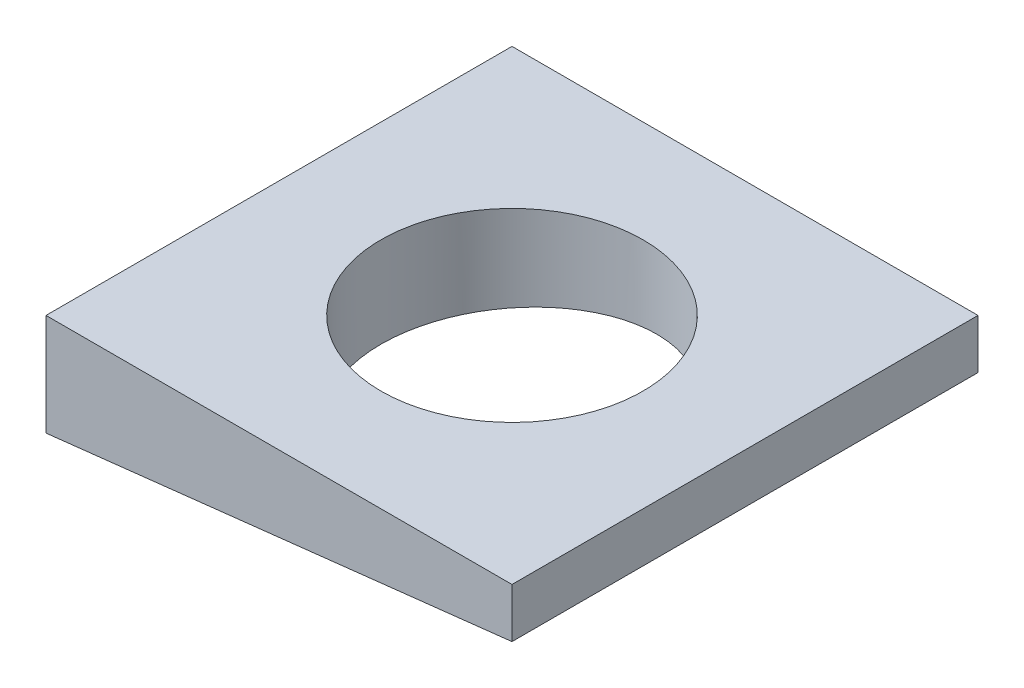
ISO-10303-21;
HEADER;
FILE_DESCRIPTION(('STEP AP214'),'2;1');
FILE_NAME('part.step','',(''),(''),'','','');
FILE_SCHEMA(('AUTOMOTIVE_DESIGN { 1 0 10303 214 1 1 1 1 }'));
ENDSEC;
DATA;
#1=APPLICATION_CONTEXT('core data for automotive mechanical design processes');
#2=APPLICATION_PROTOCOL_DEFINITION('international standard','automotive_design',2000,#1);
#3=PRODUCT_CONTEXT('',#1,'mechanical');
#4=PRODUCT('Part','Part','',(#3));
#5=PRODUCT_RELATED_PRODUCT_CATEGORY('part','',(#4));
#6=PRODUCT_DEFINITION_FORMATION('','',#4);
#7=PRODUCT_DEFINITION_CONTEXT('part definition',#1,'design');
#8=PRODUCT_DEFINITION('design','',#6,#7);
#9=PRODUCT_DEFINITION_SHAPE('','',#8);
#10=(LENGTH_UNIT() NAMED_UNIT(*) SI_UNIT(.MILLI.,.METRE.));
#11=(NAMED_UNIT(*) PLANE_ANGLE_UNIT() SI_UNIT($,.RADIAN.));
#12=(NAMED_UNIT(*) SI_UNIT($,.STERADIAN.) SOLID_ANGLE_UNIT());
#13=UNCERTAINTY_MEASURE_WITH_UNIT(LENGTH_MEASURE(1.E-05),#10,'distance_accuracy_value','');
#14=(GEOMETRIC_REPRESENTATION_CONTEXT(3) GLOBAL_UNCERTAINTY_ASSIGNED_CONTEXT((#13)) GLOBAL_UNIT_ASSIGNED_CONTEXT((#10,
#11,#12)) REPRESENTATION_CONTEXT('',''));
#15=CARTESIAN_POINT('',(0.,0.,0.));
#16=DIRECTION('',(0.,0.,1.));
#17=DIRECTION('',(1.,0.,0.));
#18=AXIS2_PLACEMENT_3D('',#15,#16,#17);
#19=CARTESIAN_POINT('',(0.,-3.5,16.));
#20=DIRECTION('',(1.,0.,0.));
#21=DIRECTION('',(0.,0.,-1.));
#22=AXIS2_PLACEMENT_3D('',#19,#20,#21);
#23=PLANE('',#22);
#24=DIRECTION('',(0.,-1.,0.));
#25=VECTOR('',#24,1.);
#26=CARTESIAN_POINT('',(0.,-3.5,0.));
#27=LINE('',#26,#25);
#28=CARTESIAN_POINT('',(0.,0.,0.));
#29=VERTEX_POINT('',#28);
#30=CARTESIAN_POINT('',(0.,-3.5,0.));
#31=VERTEX_POINT('',#30);
#32=EDGE_CURVE('E73',#29,#31,#27,.T.);
#33=ORIENTED_EDGE('',*,*,#32,.T.);
#34=DIRECTION('',(0.,0.,-1.));
#35=VECTOR('',#34,1.);
#36=CARTESIAN_POINT('',(0.,-3.5,16.));
#37=LINE('',#36,#35);
#38=CARTESIAN_POINT('',(0.,-3.5,16.));
#39=VERTEX_POINT('',#38);
#40=EDGE_CURVE('E11',#39,#31,#37,.T.);
#41=ORIENTED_EDGE('',*,*,#40,.F.);
#42=DIRECTION('',(0.,-1.,0.));
#43=VECTOR('',#42,1.);
#44=CARTESIAN_POINT('',(0.,-3.5,16.));
#45=LINE('',#44,#43);
#46=CARTESIAN_POINT('',(0.,0.,16.));
#47=VERTEX_POINT('',#46);
#48=EDGE_CURVE('E96',#47,#39,#45,.T.);
#49=ORIENTED_EDGE('',*,*,#48,.F.);
#50=DIRECTION('',(0.,0.,-1.));
#51=VECTOR('',#50,1.);
#52=CARTESIAN_POINT('',(0.,0.,16.));
#53=LINE('',#52,#51);
#54=EDGE_CURVE('E85',#47,#29,#53,.T.);
#55=ORIENTED_EDGE('',*,*,#54,.T.);
#56=EDGE_LOOP('',(#33,#41,#49,#55));
#57=FACE_BOUND('',#56,.T.);
#58=ADVANCED_FACE('F29',(#57),#23,.F.);
#59=CARTESIAN_POINT('',(16.,-1.7,16.));
#60=DIRECTION('',(-0.111794773067865,0.993731316158802,0.));
#61=DIRECTION('',(-0.993731316158802,-0.111794773067865,0.));
#62=AXIS2_PLACEMENT_3D('',#59,#60,#61);
#63=PLANE('',#62);
#64=CARTESIAN_POINT('',(8.,-2.6,8.));
#65=DIRECTION('',(-0.111794773067865,0.993731316158802,0.));
#66=DIRECTION('',(0.993731316158802,0.111794773067865,0.));
#67=AXIS2_PLACEMENT_3D('',#64,#65,#66);
#68=ELLIPSE('',#67,4.52838702658021,4.5);
#69=CARTESIAN_POINT('',(12.5,-2.09375,8.));
#70=VERTEX_POINT('',#69);
#71=EDGE_CURVE('E86',#70,#70,#68,.T.);
#72=ORIENTED_EDGE('',*,*,#71,.T.);
#73=EDGE_LOOP('',(#72));
#74=FACE_BOUND('',#73,.T.);
#75=DIRECTION('',(0.993731316158802,0.111794773067865,0.));
#76=VECTOR('',#75,1.);
#77=CARTESIAN_POINT('',(16.,-1.7,0.));
#78=LINE('',#77,#76);
#79=CARTESIAN_POINT('',(16.,-1.7,0.));
#80=VERTEX_POINT('',#79);
#81=EDGE_CURVE('E69',#31,#80,#78,.T.);
#82=ORIENTED_EDGE('',*,*,#81,.T.);
#83=DIRECTION('',(0.,0.,-1.));
#84=VECTOR('',#83,1.);
#85=CARTESIAN_POINT('',(16.,-1.7,16.));
#86=LINE('',#85,#84);
#87=CARTESIAN_POINT('',(16.,-1.7,16.));
#88=VERTEX_POINT('',#87);
#89=EDGE_CURVE('E36',#88,#80,#86,.T.);
#90=ORIENTED_EDGE('',*,*,#89,.F.);
#91=DIRECTION('',(0.993731316158802,0.111794773067865,0.));
#92=VECTOR('',#91,1.);
#93=CARTESIAN_POINT('',(16.,-1.7,16.));
#94=LINE('',#93,#92);
#95=EDGE_CURVE('E81',#39,#88,#94,.T.);
#96=ORIENTED_EDGE('',*,*,#95,.F.);
#97=ORIENTED_EDGE('',*,*,#40,.T.);
#98=EDGE_LOOP('',(#82,#90,#96,#97));
#99=FACE_BOUND('',#98,.T.);
#100=ADVANCED_FACE('F80',(#74,#99),#63,.F.);
#101=CARTESIAN_POINT('',(16.,0.,16.));
#102=DIRECTION('',(-1.,0.,0.));
#103=DIRECTION('',(0.,0.,1.));
#104=AXIS2_PLACEMENT_3D('',#101,#102,#103);
#105=PLANE('',#104);
#106=DIRECTION('',(0.,1.,0.));
#107=VECTOR('',#106,1.);
#108=CARTESIAN_POINT('',(16.,0.,0.));
#109=LINE('',#108,#107);
#110=CARTESIAN_POINT('',(16.,0.,0.));
#111=VERTEX_POINT('',#110);
#112=EDGE_CURVE('E74',#80,#111,#109,.T.);
#113=ORIENTED_EDGE('',*,*,#112,.T.);
#114=DIRECTION('',(0.,0.,-1.));
#115=VECTOR('',#114,1.);
#116=CARTESIAN_POINT('',(16.,0.,16.));
#117=LINE('',#116,#115);
#118=CARTESIAN_POINT('',(16.,0.,16.));
#119=VERTEX_POINT('',#118);
#120=EDGE_CURVE('E102',#119,#111,#117,.T.);
#121=ORIENTED_EDGE('',*,*,#120,.F.);
#122=DIRECTION('',(0.,1.,0.));
#123=VECTOR('',#122,1.);
#124=CARTESIAN_POINT('',(16.,0.,16.));
#125=LINE('',#124,#123);
#126=EDGE_CURVE('E48',#88,#119,#125,.T.);
#127=ORIENTED_EDGE('',*,*,#126,.F.);
#128=ORIENTED_EDGE('',*,*,#89,.T.);
#129=EDGE_LOOP('',(#113,#121,#127,#128));
#130=FACE_BOUND('',#129,.T.);
#131=ADVANCED_FACE('F105',(#130),#105,.F.);
#132=CARTESIAN_POINT('',(0.,0.,16.));
#133=DIRECTION('',(0.,-1.,0.));
#134=DIRECTION('',(0.,0.,-1.));
#135=AXIS2_PLACEMENT_3D('',#132,#133,#134);
#136=PLANE('',#135);
#137=CARTESIAN_POINT('',(8.,0.,8.));
#138=DIRECTION('',(0.,1.,0.));
#139=DIRECTION('',(0.,0.,1.));
#140=AXIS2_PLACEMENT_3D('',#137,#138,#139);
#141=CIRCLE('',#140,4.5);
#142=CARTESIAN_POINT('',(8.,0.,12.5));
#143=VERTEX_POINT('',#142);
#144=EDGE_CURVE('E89',#143,#143,#141,.T.);
#145=ORIENTED_EDGE('',*,*,#144,.F.);
#146=EDGE_LOOP('',(#145));
#147=FACE_BOUND('',#146,.T.);
#148=DIRECTION('',(-1.,0.,0.));
#149=VECTOR('',#148,1.);
#150=CARTESIAN_POINT('',(0.,0.,0.));
#151=LINE('',#150,#149);
#152=EDGE_CURVE('E94',#111,#29,#151,.T.);
#153=ORIENTED_EDGE('',*,*,#152,.T.);
#154=ORIENTED_EDGE('',*,*,#54,.F.);
#155=DIRECTION('',(-1.,0.,0.));
#156=VECTOR('',#155,1.);
#157=CARTESIAN_POINT('',(0.,0.,16.));
#158=LINE('',#157,#156);
#159=EDGE_CURVE('E43',#119,#47,#158,.T.);
#160=ORIENTED_EDGE('',*,*,#159,.F.);
#161=ORIENTED_EDGE('',*,*,#120,.T.);
#162=EDGE_LOOP('',(#153,#154,#160,#161));
#163=FACE_BOUND('',#162,.T.);
#164=ADVANCED_FACE('F107',(#147,#163),#136,.F.);
#165=CARTESIAN_POINT('',(0.,0.,16.));
#166=DIRECTION('',(0.,0.,-1.));
#167=DIRECTION('',(-1.,0.,0.));
#168=AXIS2_PLACEMENT_3D('',#165,#166,#167);
#169=PLANE('',#168);
#170=ORIENTED_EDGE('',*,*,#48,.T.);
#171=ORIENTED_EDGE('',*,*,#95,.T.);
#172=ORIENTED_EDGE('',*,*,#126,.T.);
#173=ORIENTED_EDGE('',*,*,#159,.T.);
#174=EDGE_LOOP('',(#170,#171,#172,#173));
#175=FACE_BOUND('',#174,.T.);
#176=ADVANCED_FACE('F108',(#175),#169,.F.);
#177=CARTESIAN_POINT('',(0.,0.,0.));
#178=DIRECTION('',(0.,0.,-1.));
#179=DIRECTION('',(-1.,0.,0.));
#180=AXIS2_PLACEMENT_3D('',#177,#178,#179);
#181=PLANE('',#180);
#182=ORIENTED_EDGE('',*,*,#32,.F.);
#183=ORIENTED_EDGE('',*,*,#152,.F.);
#184=ORIENTED_EDGE('',*,*,#112,.F.);
#185=ORIENTED_EDGE('',*,*,#81,.F.);
#186=EDGE_LOOP('',(#182,#183,#184,#185));
#187=FACE_BOUND('',#186,.T.);
#188=ADVANCED_FACE('F70',(#187),#181,.T.);
#189=CARTESIAN_POINT('',(8.,-3.5,8.));
#190=DIRECTION('',(0.,1.,0.));
#191=DIRECTION('',(0.,0.,1.));
#192=AXIS2_PLACEMENT_3D('',#189,#190,#191);
#193=CYLINDRICAL_SURFACE('',#192,4.5);
#194=ORIENTED_EDGE('',*,*,#144,.T.);
#195=EDGE_LOOP('',(#194));
#196=FACE_BOUND('',#195,.T.);
#197=ORIENTED_EDGE('',*,*,#71,.F.);
#198=EDGE_LOOP('',(#197));
#199=FACE_BOUND('',#198,.T.);
#200=ADVANCED_FACE('F115',(#196,#199),#193,.F.);
#201=CLOSED_SHELL('',(#58,#100,#131,#164,#176,#188,#200));
#202=MANIFOLD_SOLID_BREP('B2',#201);
#203=ADVANCED_BREP_SHAPE_REPRESENTATION('',(#18,#202),#14);
#204=SHAPE_DEFINITION_REPRESENTATION(#9,#203);
ENDSEC;
END-ISO-10303-21;
